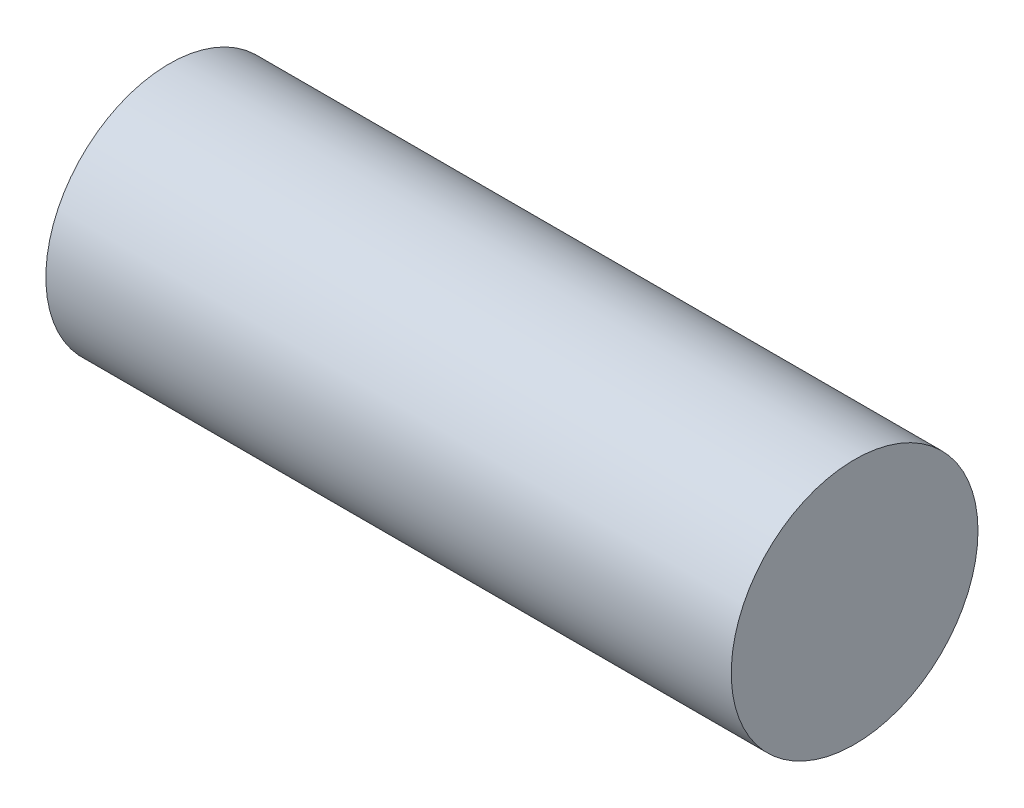
ISO-10303-21;
HEADER;
FILE_DESCRIPTION(('STEP AP214'),'2;1');
FILE_NAME('part.step','',(''),(''),'','','');
FILE_SCHEMA(('AUTOMOTIVE_DESIGN { 1 0 10303 214 1 1 1 1 }'));
ENDSEC;
DATA;
#1=APPLICATION_CONTEXT('core data for automotive mechanical design processes');
#2=APPLICATION_PROTOCOL_DEFINITION('international standard','automotive_design',2000,#1);
#3=PRODUCT_CONTEXT('',#1,'mechanical');
#4=PRODUCT('Part','Part','',(#3));
#5=PRODUCT_RELATED_PRODUCT_CATEGORY('part','',(#4));
#6=PRODUCT_DEFINITION_FORMATION('','',#4);
#7=PRODUCT_DEFINITION_CONTEXT('part definition',#1,'design');
#8=PRODUCT_DEFINITION('design','',#6,#7);
#9=PRODUCT_DEFINITION_SHAPE('','',#8);
#10=(LENGTH_UNIT() NAMED_UNIT(*) SI_UNIT(.MILLI.,.METRE.));
#11=(NAMED_UNIT(*) PLANE_ANGLE_UNIT() SI_UNIT($,.RADIAN.));
#12=(NAMED_UNIT(*) SI_UNIT($,.STERADIAN.) SOLID_ANGLE_UNIT());
#13=UNCERTAINTY_MEASURE_WITH_UNIT(LENGTH_MEASURE(1.E-05),#10,'distance_accuracy_value','');
#14=(GEOMETRIC_REPRESENTATION_CONTEXT(3) GLOBAL_UNCERTAINTY_ASSIGNED_CONTEXT((#13)) GLOBAL_UNIT_ASSIGNED_CONTEXT((#10,
#11,#12)) REPRESENTATION_CONTEXT('',''));
#15=CARTESIAN_POINT('',(0.,0.,0.));
#16=DIRECTION('',(0.,0.,1.));
#17=DIRECTION('',(1.,0.,0.));
#18=AXIS2_PLACEMENT_3D('',#15,#16,#17);
#19=CARTESIAN_POINT('',(12.5,0.,0.));
#20=DIRECTION('',(-1.,0.,0.));
#21=DIRECTION('',(0.,0.,1.));
#22=AXIS2_PLACEMENT_3D('',#19,#20,#21);
#23=CYLINDRICAL_SURFACE('',#22,2.25);
#24=CARTESIAN_POINT('',(12.5,0.,0.));
#25=DIRECTION('',(1.,0.,0.));
#26=DIRECTION('',(0.,0.,-1.));
#27=AXIS2_PLACEMENT_3D('',#24,#25,#26);
#28=CIRCLE('',#27,2.25);
#29=CARTESIAN_POINT('',(12.5,0.,-2.25));
#30=VERTEX_POINT('',#29);
#31=EDGE_CURVE('E10',#30,#30,#28,.T.);
#32=ORIENTED_EDGE('',*,*,#31,.F.);
#33=EDGE_LOOP('',(#32));
#34=FACE_BOUND('',#33,.T.);
#35=CARTESIAN_POINT('',(0.,0.,0.));
#36=DIRECTION('',(1.,0.,0.));
#37=DIRECTION('',(0.,0.,-1.));
#38=AXIS2_PLACEMENT_3D('',#35,#36,#37);
#39=CIRCLE('',#38,2.25);
#40=CARTESIAN_POINT('',(0.,0.,-2.25));
#41=VERTEX_POINT('',#40);
#42=EDGE_CURVE('E37',#41,#41,#39,.T.);
#43=ORIENTED_EDGE('',*,*,#42,.T.);
#44=EDGE_LOOP('',(#43));
#45=FACE_BOUND('',#44,.T.);
#46=ADVANCED_FACE('F34',(#34,#45),#23,.T.);
#47=CARTESIAN_POINT('',(12.5,0.,0.));
#48=DIRECTION('',(1.,0.,0.));
#49=DIRECTION('',(0.,0.,-1.));
#50=AXIS2_PLACEMENT_3D('',#47,#48,#49);
#51=PLANE('',#50);
#52=ORIENTED_EDGE('',*,*,#31,.T.);
#53=EDGE_LOOP('',(#52));
#54=FACE_BOUND('',#53,.T.);
#55=ADVANCED_FACE('F49',(#54),#51,.T.);
#56=CARTESIAN_POINT('',(0.,0.,0.));
#57=DIRECTION('',(1.,0.,0.));
#58=DIRECTION('',(0.,0.,-1.));
#59=AXIS2_PLACEMENT_3D('',#56,#57,#58);
#60=PLANE('',#59);
#61=ORIENTED_EDGE('',*,*,#42,.F.);
#62=EDGE_LOOP('',(#61));
#63=FACE_BOUND('',#62,.T.);
#64=ADVANCED_FACE('F47',(#63),#60,.F.);
#65=CLOSED_SHELL('',(#46,#55,#64));
#66=MANIFOLD_SOLID_BREP('B2',#65);
#67=ADVANCED_BREP_SHAPE_REPRESENTATION('',(#18,#66),#14);
#68=SHAPE_DEFINITION_REPRESENTATION(#9,#67);
ENDSEC;
END-ISO-10303-21;
